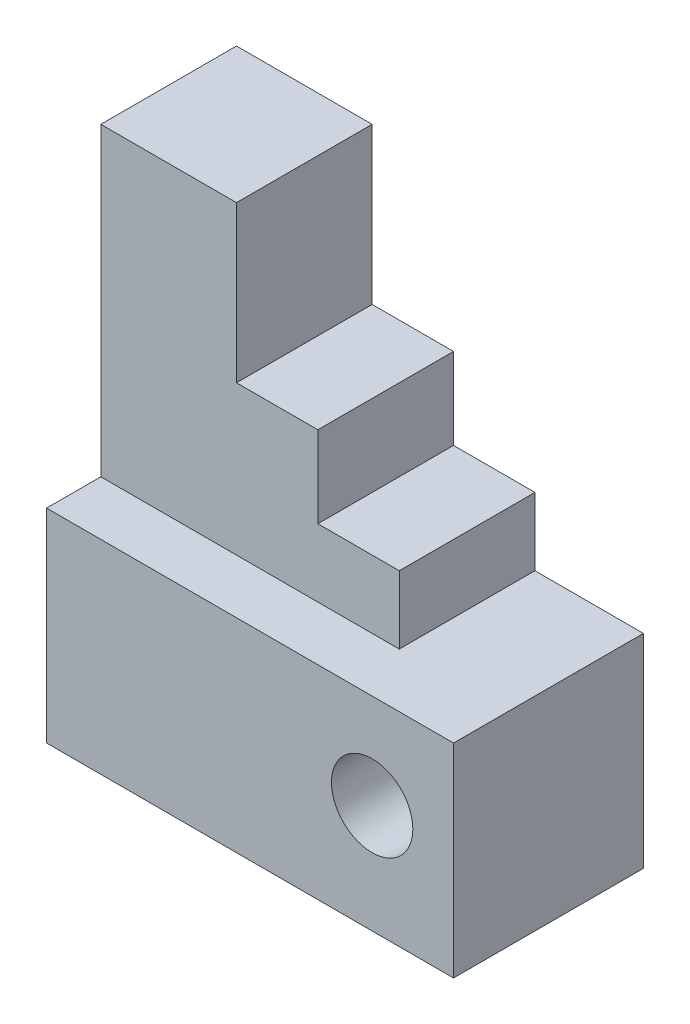
ISO-10303-21;
HEADER;
FILE_DESCRIPTION(('STEP AP214'),'2;1');
FILE_NAME('part.step','',(''),(''),'','','');
FILE_SCHEMA(('AUTOMOTIVE_DESIGN { 1 0 10303 214 1 1 1 1 }'));
ENDSEC;
DATA;
#1=APPLICATION_CONTEXT('core data for automotive mechanical design processes');
#2=APPLICATION_PROTOCOL_DEFINITION('international standard','automotive_design',2000,#1);
#3=PRODUCT_CONTEXT('',#1,'mechanical');
#4=PRODUCT('Part','Part','',(#3));
#5=PRODUCT_RELATED_PRODUCT_CATEGORY('part','',(#4));
#6=PRODUCT_DEFINITION_FORMATION('','',#4);
#7=PRODUCT_DEFINITION_CONTEXT('part definition',#1,'design');
#8=PRODUCT_DEFINITION('design','',#6,#7);
#9=PRODUCT_DEFINITION_SHAPE('','',#8);
#10=(LENGTH_UNIT() NAMED_UNIT(*) SI_UNIT(.MILLI.,.METRE.));
#11=(NAMED_UNIT(*) PLANE_ANGLE_UNIT() SI_UNIT($,.RADIAN.));
#12=(NAMED_UNIT(*) SI_UNIT($,.STERADIAN.) SOLID_ANGLE_UNIT());
#13=UNCERTAINTY_MEASURE_WITH_UNIT(LENGTH_MEASURE(1.E-05),#10,'distance_accuracy_value','');
#14=(GEOMETRIC_REPRESENTATION_CONTEXT(3) GLOBAL_UNCERTAINTY_ASSIGNED_CONTEXT((#13)) GLOBAL_UNIT_ASSIGNED_CONTEXT((#10,
#11,#12)) REPRESENTATION_CONTEXT('',''));
#15=CARTESIAN_POINT('',(0.,0.,0.));
#16=DIRECTION('',(0.,0.,1.));
#17=DIRECTION('',(1.,0.,0.));
#18=AXIS2_PLACEMENT_3D('',#15,#16,#17);
#19=CARTESIAN_POINT('',(12.,14.,28.));
#20=DIRECTION('',(0.,-1.,0.));
#21=DIRECTION('',(0.,0.,-1.));
#22=AXIS2_PLACEMENT_3D('',#19,#20,#21);
#23=PLANE('',#22);
#24=DIRECTION('',(0.,0.,-1.));
#25=VECTOR('',#24,1.);
#26=CARTESIAN_POINT('',(-4.,14.,20.));
#27=LINE('',#26,#25);
#28=CARTESIAN_POINT('',(-4.,14.,20.));
#29=VERTEX_POINT('',#28);
#30=CARTESIAN_POINT('',(-4.,14.,0.));
#31=VERTEX_POINT('',#30);
#32=EDGE_CURVE('E207',#29,#31,#27,.T.);
#33=ORIENTED_EDGE('',*,*,#32,.F.);
#34=DIRECTION('',(-1.,0.,0.));
#35=VECTOR('',#34,1.);
#36=CARTESIAN_POINT('',(-48.,14.,20.));
#37=LINE('',#36,#35);
#38=CARTESIAN_POINT('',(-48.,14.,20.));
#39=VERTEX_POINT('',#38);
#40=EDGE_CURVE('E163',#29,#39,#37,.T.);
#41=ORIENTED_EDGE('',*,*,#40,.T.);
#42=DIRECTION('',(0.,0.,-1.));
#43=VECTOR('',#42,1.);
#44=CARTESIAN_POINT('',(-48.,14.,28.));
#45=LINE('',#44,#43);
#46=CARTESIAN_POINT('',(-48.,14.,28.));
#47=VERTEX_POINT('',#46);
#48=EDGE_CURVE('E161',#47,#39,#45,.T.);
#49=ORIENTED_EDGE('',*,*,#48,.F.);
#50=DIRECTION('',(-1.,0.,0.));
#51=VECTOR('',#50,1.);
#52=CARTESIAN_POINT('',(12.,14.,28.));
#53=LINE('',#52,#51);
#54=CARTESIAN_POINT('',(12.,14.,28.));
#55=VERTEX_POINT('',#54);
#56=EDGE_CURVE('E70',#55,#47,#53,.T.);
#57=ORIENTED_EDGE('',*,*,#56,.F.);
#58=DIRECTION('',(0.,0.,-1.));
#59=VECTOR('',#58,1.);
#60=CARTESIAN_POINT('',(12.,14.,28.));
#61=LINE('',#60,#59);
#62=CARTESIAN_POINT('',(12.,14.,0.));
#63=VERTEX_POINT('',#62);
#64=EDGE_CURVE('E256',#55,#63,#61,.T.);
#65=ORIENTED_EDGE('',*,*,#64,.T.);
#66=DIRECTION('',(-1.,0.,0.));
#67=VECTOR('',#66,1.);
#68=CARTESIAN_POINT('',(12.,14.,0.));
#69=LINE('',#68,#67);
#70=EDGE_CURVE('E236',#63,#31,#69,.T.);
#71=ORIENTED_EDGE('',*,*,#70,.T.);
#72=EDGE_LOOP('',(#33,#41,#49,#57,#65,#71));
#73=FACE_BOUND('',#72,.T.);
#74=ADVANCED_FACE('F45',(#73),#23,.F.);
#75=CARTESIAN_POINT('',(0.,0.,28.));
#76=DIRECTION('',(0.,0.,-1.));
#77=DIRECTION('',(-1.,0.,0.));
#78=AXIS2_PLACEMENT_3D('',#75,#76,#77);
#79=PLANE('',#78);
#80=DIRECTION('',(0.,-1.,0.));
#81=VECTOR('',#80,1.);
#82=CARTESIAN_POINT('',(-48.,14.,28.));
#83=LINE('',#82,#81);
#84=CARTESIAN_POINT('',(-48.,-16.,28.));
#85=VERTEX_POINT('',#84);
#86=EDGE_CURVE('E233',#47,#85,#83,.T.);
#87=ORIENTED_EDGE('',*,*,#86,.T.);
#88=DIRECTION('',(1.,0.,0.));
#89=VECTOR('',#88,1.);
#90=CARTESIAN_POINT('',(12.,-16.,28.));
#91=LINE('',#90,#89);
#92=CARTESIAN_POINT('',(12.,-16.,28.));
#93=VERTEX_POINT('',#92);
#94=EDGE_CURVE('E96',#85,#93,#91,.T.);
#95=ORIENTED_EDGE('',*,*,#94,.T.);
#96=DIRECTION('',(0.,1.,0.));
#97=VECTOR('',#96,1.);
#98=CARTESIAN_POINT('',(12.,-16.,28.));
#99=LINE('',#98,#97);
#100=EDGE_CURVE('E239',#93,#55,#99,.T.);
#101=ORIENTED_EDGE('',*,*,#100,.T.);
#102=ORIENTED_EDGE('',*,*,#56,.T.);
#103=EDGE_LOOP('',(#87,#95,#101,#102));
#104=FACE_BOUND('',#103,.T.);
#105=CARTESIAN_POINT('',(0.,0.,28.));
#106=DIRECTION('',(0.,0.,1.));
#107=DIRECTION('',(1.,0.,0.));
#108=AXIS2_PLACEMENT_3D('',#105,#106,#107);
#109=CIRCLE('',#108,6.);
#110=CARTESIAN_POINT('',(6.,0.,28.));
#111=VERTEX_POINT('',#110);
#112=EDGE_CURVE('E225',#111,#111,#109,.T.);
#113=ORIENTED_EDGE('',*,*,#112,.F.);
#114=EDGE_LOOP('',(#113));
#115=FACE_BOUND('',#114,.T.);
#116=ADVANCED_FACE('F269',(#104,#115),#79,.F.);
#117=CARTESIAN_POINT('',(0.,0.,0.));
#118=DIRECTION('',(0.,0.,-1.));
#119=DIRECTION('',(-1.,0.,0.));
#120=AXIS2_PLACEMENT_3D('',#117,#118,#119);
#121=PLANE('',#120);
#122=DIRECTION('',(0.,-1.,0.));
#123=VECTOR('',#122,1.);
#124=CARTESIAN_POINT('',(-48.,14.,0.));
#125=LINE('',#124,#123);
#126=CARTESIAN_POINT('',(-48.,59.,0.));
#127=VERTEX_POINT('',#126);
#128=CARTESIAN_POINT('',(-48.,-16.,0.));
#129=VERTEX_POINT('',#128);
#130=EDGE_CURVE('E229',#127,#129,#125,.T.);
#131=ORIENTED_EDGE('',*,*,#130,.F.);
#132=DIRECTION('',(1.,0.,0.));
#133=VECTOR('',#132,1.);
#134=CARTESIAN_POINT('',(-48.,59.,0.));
#135=LINE('',#134,#133);
#136=CARTESIAN_POINT('',(-28.,59.,0.));
#137=VERTEX_POINT('',#136);
#138=EDGE_CURVE('E145',#127,#137,#135,.T.);
#139=ORIENTED_EDGE('',*,*,#138,.T.);
#140=DIRECTION('',(0.,-1.,0.));
#141=VECTOR('',#140,1.);
#142=CARTESIAN_POINT('',(-28.,36.,0.));
#143=LINE('',#142,#141);
#144=CARTESIAN_POINT('',(-28.,36.,0.));
#145=VERTEX_POINT('',#144);
#146=EDGE_CURVE('E188',#137,#145,#143,.T.);
#147=ORIENTED_EDGE('',*,*,#146,.T.);
#148=DIRECTION('',(1.,0.,0.));
#149=VECTOR('',#148,1.);
#150=CARTESIAN_POINT('',(-16.,36.,0.));
#151=LINE('',#150,#149);
#152=CARTESIAN_POINT('',(-16.,36.,0.));
#153=VERTEX_POINT('',#152);
#154=EDGE_CURVE('E192',#145,#153,#151,.T.);
#155=ORIENTED_EDGE('',*,*,#154,.T.);
#156=DIRECTION('',(0.,-1.,0.));
#157=VECTOR('',#156,1.);
#158=CARTESIAN_POINT('',(-16.,24.,0.));
#159=LINE('',#158,#157);
#160=CARTESIAN_POINT('',(-16.,24.,0.));
#161=VERTEX_POINT('',#160);
#162=EDGE_CURVE('E196',#153,#161,#159,.T.);
#163=ORIENTED_EDGE('',*,*,#162,.T.);
#164=DIRECTION('',(1.,0.,0.));
#165=VECTOR('',#164,1.);
#166=CARTESIAN_POINT('',(-4.,24.,0.));
#167=LINE('',#166,#165);
#168=CARTESIAN_POINT('',(-4.,24.,0.));
#169=VERTEX_POINT('',#168);
#170=EDGE_CURVE('E200',#161,#169,#167,.T.);
#171=ORIENTED_EDGE('',*,*,#170,.T.);
#172=DIRECTION('',(0.,-1.,0.));
#173=VECTOR('',#172,1.);
#174=CARTESIAN_POINT('',(-4.,14.,0.));
#175=LINE('',#174,#173);
#176=EDGE_CURVE('E166',#169,#31,#175,.T.);
#177=ORIENTED_EDGE('',*,*,#176,.T.);
#178=ORIENTED_EDGE('',*,*,#70,.F.);
#179=DIRECTION('',(0.,1.,0.));
#180=VECTOR('',#179,1.);
#181=CARTESIAN_POINT('',(12.,-16.,0.));
#182=LINE('',#181,#180);
#183=CARTESIAN_POINT('',(12.,-16.,0.));
#184=VERTEX_POINT('',#183);
#185=EDGE_CURVE('E89',#184,#63,#182,.T.);
#186=ORIENTED_EDGE('',*,*,#185,.F.);
#187=DIRECTION('',(1.,0.,0.));
#188=VECTOR('',#187,1.);
#189=CARTESIAN_POINT('',(12.,-16.,0.));
#190=LINE('',#189,#188);
#191=EDGE_CURVE('E246',#129,#184,#190,.T.);
#192=ORIENTED_EDGE('',*,*,#191,.F.);
#193=EDGE_LOOP('',(#131,#139,#147,#155,#163,#171,#177,#178,#186,#192));
#194=FACE_BOUND('',#193,.T.);
#195=CARTESIAN_POINT('',(0.,0.,0.));
#196=DIRECTION('',(0.,0.,1.));
#197=DIRECTION('',(1.,0.,0.));
#198=AXIS2_PLACEMENT_3D('',#195,#196,#197);
#199=CIRCLE('',#198,6.);
#200=CARTESIAN_POINT('',(6.,0.,0.));
#201=VERTEX_POINT('',#200);
#202=EDGE_CURVE('E210',#201,#201,#199,.T.);
#203=ORIENTED_EDGE('',*,*,#202,.T.);
#204=EDGE_LOOP('',(#203));
#205=FACE_BOUND('',#204,.T.);
#206=ADVANCED_FACE('F263',(#194,#205),#121,.T.);
#207=CARTESIAN_POINT('',(-48.,14.,28.));
#208=DIRECTION('',(1.,0.,0.));
#209=DIRECTION('',(0.,0.,-1.));
#210=AXIS2_PLACEMENT_3D('',#207,#208,#209);
#211=PLANE('',#210);
#212=ORIENTED_EDGE('',*,*,#130,.T.);
#213=DIRECTION('',(0.,0.,-1.));
#214=VECTOR('',#213,1.);
#215=CARTESIAN_POINT('',(-48.,-16.,28.));
#216=LINE('',#215,#214);
#217=EDGE_CURVE('E11',#85,#129,#216,.T.);
#218=ORIENTED_EDGE('',*,*,#217,.F.);
#219=ORIENTED_EDGE('',*,*,#86,.F.);
#220=ORIENTED_EDGE('',*,*,#48,.T.);
#221=DIRECTION('',(0.,1.,0.));
#222=VECTOR('',#221,1.);
#223=CARTESIAN_POINT('',(-48.,14.,20.));
#224=LINE('',#223,#222);
#225=CARTESIAN_POINT('',(-48.,59.,20.));
#226=VERTEX_POINT('',#225);
#227=EDGE_CURVE('E61',#39,#226,#224,.T.);
#228=ORIENTED_EDGE('',*,*,#227,.T.);
#229=DIRECTION('',(0.,0.,-1.));
#230=VECTOR('',#229,1.);
#231=CARTESIAN_POINT('',(-48.,59.,20.));
#232=LINE('',#231,#230);
#233=EDGE_CURVE('E141',#226,#127,#232,.T.);
#234=ORIENTED_EDGE('',*,*,#233,.T.);
#235=EDGE_LOOP('',(#212,#218,#219,#220,#228,#234));
#236=FACE_BOUND('',#235,.T.);
#237=ADVANCED_FACE('F47',(#236),#211,.F.);
#238=CARTESIAN_POINT('',(12.,-16.,28.));
#239=DIRECTION('',(0.,1.,0.));
#240=DIRECTION('',(0.,0.,1.));
#241=AXIS2_PLACEMENT_3D('',#238,#239,#240);
#242=PLANE('',#241);
#243=ORIENTED_EDGE('',*,*,#191,.T.);
#244=DIRECTION('',(0.,0.,-1.));
#245=VECTOR('',#244,1.);
#246=CARTESIAN_POINT('',(12.,-16.,28.));
#247=LINE('',#246,#245);
#248=EDGE_CURVE('E54',#93,#184,#247,.T.);
#249=ORIENTED_EDGE('',*,*,#248,.F.);
#250=ORIENTED_EDGE('',*,*,#94,.F.);
#251=ORIENTED_EDGE('',*,*,#217,.T.);
#252=EDGE_LOOP('',(#243,#249,#250,#251));
#253=FACE_BOUND('',#252,.T.);
#254=ADVANCED_FACE('F287',(#253),#242,.F.);
#255=CARTESIAN_POINT('',(12.,-16.,28.));
#256=DIRECTION('',(-1.,0.,0.));
#257=DIRECTION('',(0.,0.,1.));
#258=AXIS2_PLACEMENT_3D('',#255,#256,#257);
#259=PLANE('',#258);
#260=ORIENTED_EDGE('',*,*,#185,.T.);
#261=ORIENTED_EDGE('',*,*,#64,.F.);
#262=ORIENTED_EDGE('',*,*,#100,.F.);
#263=ORIENTED_EDGE('',*,*,#248,.T.);
#264=EDGE_LOOP('',(#260,#261,#262,#263));
#265=FACE_BOUND('',#264,.T.);
#266=ADVANCED_FACE('F260',(#265),#259,.F.);
#267=CARTESIAN_POINT('',(0.,0.,28.));
#268=DIRECTION('',(0.,0.,-1.));
#269=DIRECTION('',(-1.,0.,0.));
#270=AXIS2_PLACEMENT_3D('',#267,#268,#269);
#271=CYLINDRICAL_SURFACE('',#270,6.);
#272=ORIENTED_EDGE('',*,*,#112,.T.);
#273=EDGE_LOOP('',(#272));
#274=FACE_BOUND('',#273,.T.);
#275=ORIENTED_EDGE('',*,*,#202,.F.);
#276=EDGE_LOOP('',(#275));
#277=FACE_BOUND('',#276,.T.);
#278=ADVANCED_FACE('F275',(#274,#277),#271,.F.);
#279=CARTESIAN_POINT('',(-4.,14.,20.));
#280=DIRECTION('',(1.,0.,0.));
#281=DIRECTION('',(0.,0.,-1.));
#282=AXIS2_PLACEMENT_3D('',#279,#280,#281);
#283=PLANE('',#282);
#284=ORIENTED_EDGE('',*,*,#176,.F.);
#285=DIRECTION('',(0.,0.,-1.));
#286=VECTOR('',#285,1.);
#287=CARTESIAN_POINT('',(-4.,24.,20.));
#288=LINE('',#287,#286);
#289=CARTESIAN_POINT('',(-4.,24.,20.));
#290=VERTEX_POINT('',#289);
#291=EDGE_CURVE('E211',#290,#169,#288,.T.);
#292=ORIENTED_EDGE('',*,*,#291,.F.);
#293=DIRECTION('',(0.,-1.,0.));
#294=VECTOR('',#293,1.);
#295=CARTESIAN_POINT('',(-4.,14.,20.));
#296=LINE('',#295,#294);
#297=EDGE_CURVE('E150',#290,#29,#296,.T.);
#298=ORIENTED_EDGE('',*,*,#297,.T.);
#299=ORIENTED_EDGE('',*,*,#32,.T.);
#300=EDGE_LOOP('',(#284,#292,#298,#299));
#301=FACE_BOUND('',#300,.T.);
#302=ADVANCED_FACE('F278',(#301),#283,.T.);
#303=CARTESIAN_POINT('',(-4.,24.,20.));
#304=DIRECTION('',(0.,1.,0.));
#305=DIRECTION('',(0.,0.,1.));
#306=AXIS2_PLACEMENT_3D('',#303,#304,#305);
#307=PLANE('',#306);
#308=ORIENTED_EDGE('',*,*,#170,.F.);
#309=DIRECTION('',(0.,0.,-1.));
#310=VECTOR('',#309,1.);
#311=CARTESIAN_POINT('',(-16.,24.,20.));
#312=LINE('',#311,#310);
#313=CARTESIAN_POINT('',(-16.,24.,20.));
#314=VERTEX_POINT('',#313);
#315=EDGE_CURVE('E214',#314,#161,#312,.T.);
#316=ORIENTED_EDGE('',*,*,#315,.F.);
#317=DIRECTION('',(1.,0.,0.));
#318=VECTOR('',#317,1.);
#319=CARTESIAN_POINT('',(-4.,24.,20.));
#320=LINE('',#319,#318);
#321=EDGE_CURVE('E179',#314,#290,#320,.T.);
#322=ORIENTED_EDGE('',*,*,#321,.T.);
#323=ORIENTED_EDGE('',*,*,#291,.T.);
#324=EDGE_LOOP('',(#308,#316,#322,#323));
#325=FACE_BOUND('',#324,.T.);
#326=ADVANCED_FACE('F311',(#325),#307,.T.);
#327=CARTESIAN_POINT('',(-16.,24.,20.));
#328=DIRECTION('',(1.,0.,0.));
#329=DIRECTION('',(0.,0.,-1.));
#330=AXIS2_PLACEMENT_3D('',#327,#328,#329);
#331=PLANE('',#330);
#332=ORIENTED_EDGE('',*,*,#162,.F.);
#333=DIRECTION('',(0.,0.,-1.));
#334=VECTOR('',#333,1.);
#335=CARTESIAN_POINT('',(-16.,36.,20.));
#336=LINE('',#335,#334);
#337=CARTESIAN_POINT('',(-16.,36.,20.));
#338=VERTEX_POINT('',#337);
#339=EDGE_CURVE('E217',#338,#153,#336,.T.);
#340=ORIENTED_EDGE('',*,*,#339,.F.);
#341=DIRECTION('',(0.,-1.,0.));
#342=VECTOR('',#341,1.);
#343=CARTESIAN_POINT('',(-16.,24.,20.));
#344=LINE('',#343,#342);
#345=EDGE_CURVE('E175',#338,#314,#344,.T.);
#346=ORIENTED_EDGE('',*,*,#345,.T.);
#347=ORIENTED_EDGE('',*,*,#315,.T.);
#348=EDGE_LOOP('',(#332,#340,#346,#347));
#349=FACE_BOUND('',#348,.T.);
#350=ADVANCED_FACE('F305',(#349),#331,.T.);
#351=CARTESIAN_POINT('',(-16.,36.,20.));
#352=DIRECTION('',(0.,1.,0.));
#353=DIRECTION('',(0.,0.,1.));
#354=AXIS2_PLACEMENT_3D('',#351,#352,#353);
#355=PLANE('',#354);
#356=ORIENTED_EDGE('',*,*,#154,.F.);
#357=DIRECTION('',(0.,0.,-1.));
#358=VECTOR('',#357,1.);
#359=CARTESIAN_POINT('',(-28.,36.,20.));
#360=LINE('',#359,#358);
#361=CARTESIAN_POINT('',(-28.,36.,20.));
#362=VERTEX_POINT('',#361);
#363=EDGE_CURVE('E220',#362,#145,#360,.T.);
#364=ORIENTED_EDGE('',*,*,#363,.F.);
#365=DIRECTION('',(1.,0.,0.));
#366=VECTOR('',#365,1.);
#367=CARTESIAN_POINT('',(-16.,36.,20.));
#368=LINE('',#367,#366);
#369=EDGE_CURVE('E171',#362,#338,#368,.T.);
#370=ORIENTED_EDGE('',*,*,#369,.T.);
#371=ORIENTED_EDGE('',*,*,#339,.T.);
#372=EDGE_LOOP('',(#356,#364,#370,#371));
#373=FACE_BOUND('',#372,.T.);
#374=ADVANCED_FACE('F301',(#373),#355,.T.);
#375=CARTESIAN_POINT('',(-28.,36.,20.));
#376=DIRECTION('',(1.,0.,0.));
#377=DIRECTION('',(0.,0.,-1.));
#378=AXIS2_PLACEMENT_3D('',#375,#376,#377);
#379=PLANE('',#378);
#380=ORIENTED_EDGE('',*,*,#146,.F.);
#381=DIRECTION('',(0.,0.,-1.));
#382=VECTOR('',#381,1.);
#383=CARTESIAN_POINT('',(-28.,59.,20.));
#384=LINE('',#383,#382);
#385=CARTESIAN_POINT('',(-28.,59.,20.));
#386=VERTEX_POINT('',#385);
#387=EDGE_CURVE('E149',#386,#137,#384,.T.);
#388=ORIENTED_EDGE('',*,*,#387,.F.);
#389=DIRECTION('',(0.,-1.,0.));
#390=VECTOR('',#389,1.);
#391=CARTESIAN_POINT('',(-28.,36.,20.));
#392=LINE('',#391,#390);
#393=EDGE_CURVE('E156',#386,#362,#392,.T.);
#394=ORIENTED_EDGE('',*,*,#393,.T.);
#395=ORIENTED_EDGE('',*,*,#363,.T.);
#396=EDGE_LOOP('',(#380,#388,#394,#395));
#397=FACE_BOUND('',#396,.T.);
#398=ADVANCED_FACE('F299',(#397),#379,.T.);
#399=CARTESIAN_POINT('',(-48.,59.,20.));
#400=DIRECTION('',(0.,1.,0.));
#401=DIRECTION('',(0.,0.,1.));
#402=AXIS2_PLACEMENT_3D('',#399,#400,#401);
#403=PLANE('',#402);
#404=ORIENTED_EDGE('',*,*,#138,.F.);
#405=ORIENTED_EDGE('',*,*,#233,.F.);
#406=DIRECTION('',(1.,0.,0.));
#407=VECTOR('',#406,1.);
#408=CARTESIAN_POINT('',(-48.,59.,20.));
#409=LINE('',#408,#407);
#410=EDGE_CURVE('E143',#226,#386,#409,.T.);
#411=ORIENTED_EDGE('',*,*,#410,.T.);
#412=ORIENTED_EDGE('',*,*,#387,.T.);
#413=EDGE_LOOP('',(#404,#405,#411,#412));
#414=FACE_BOUND('',#413,.T.);
#415=ADVANCED_FACE('F142',(#414),#403,.T.);
#416=CARTESIAN_POINT('',(0.,0.,20.));
#417=DIRECTION('',(0.,0.,1.));
#418=DIRECTION('',(1.,0.,0.));
#419=AXIS2_PLACEMENT_3D('',#416,#417,#418);
#420=PLANE('',#419);
#421=ORIENTED_EDGE('',*,*,#40,.F.);
#422=ORIENTED_EDGE('',*,*,#297,.F.);
#423=ORIENTED_EDGE('',*,*,#321,.F.);
#424=ORIENTED_EDGE('',*,*,#345,.F.);
#425=ORIENTED_EDGE('',*,*,#369,.F.);
#426=ORIENTED_EDGE('',*,*,#393,.F.);
#427=ORIENTED_EDGE('',*,*,#410,.F.);
#428=ORIENTED_EDGE('',*,*,#227,.F.);
#429=EDGE_LOOP('',(#421,#422,#423,#424,#425,#426,#427,#428));
#430=FACE_BOUND('',#429,.T.);
#431=ADVANCED_FACE('F153',(#430),#420,.T.);
#432=CLOSED_SHELL('',(#74,#116,#206,#237,#254,#266,#278,#302,#326,#350,#374,#398,#415,#431));
#433=MANIFOLD_SOLID_BREP('B2',#432);
#434=ADVANCED_BREP_SHAPE_REPRESENTATION('',(#18,#433),#14);
#435=SHAPE_DEFINITION_REPRESENTATION(#9,#434);
ENDSEC;
END-ISO-10303-21;
